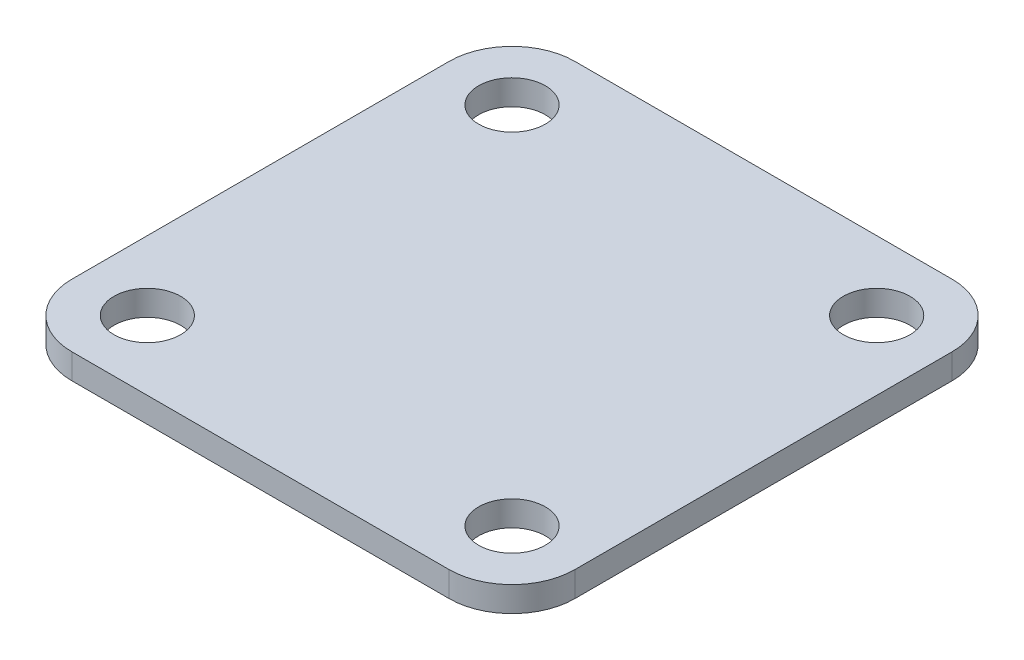
ISO-10303-21;
HEADER;
FILE_DESCRIPTION(('STEP AP214'),'2;1');
FILE_NAME('part.step','',(''),(''),'','','');
FILE_SCHEMA(('AUTOMOTIVE_DESIGN { 1 0 10303 214 1 1 1 1 }'));
ENDSEC;
DATA;
#1=APPLICATION_CONTEXT('core data for automotive mechanical design processes');
#2=APPLICATION_PROTOCOL_DEFINITION('international standard','automotive_design',2000,#1);
#3=PRODUCT_CONTEXT('',#1,'mechanical');
#4=PRODUCT('Part','Part','',(#3));
#5=PRODUCT_RELATED_PRODUCT_CATEGORY('part','',(#4));
#6=PRODUCT_DEFINITION_FORMATION('','',#4);
#7=PRODUCT_DEFINITION_CONTEXT('part definition',#1,'design');
#8=PRODUCT_DEFINITION('design','',#6,#7);
#9=PRODUCT_DEFINITION_SHAPE('','',#8);
#10=(LENGTH_UNIT() NAMED_UNIT(*) SI_UNIT(.MILLI.,.METRE.));
#11=(NAMED_UNIT(*) PLANE_ANGLE_UNIT() SI_UNIT($,.RADIAN.));
#12=(NAMED_UNIT(*) SI_UNIT($,.STERADIAN.) SOLID_ANGLE_UNIT());
#13=UNCERTAINTY_MEASURE_WITH_UNIT(LENGTH_MEASURE(1.E-05),#10,'distance_accuracy_value','');
#14=(GEOMETRIC_REPRESENTATION_CONTEXT(3) GLOBAL_UNCERTAINTY_ASSIGNED_CONTEXT((#13)) GLOBAL_UNIT_ASSIGNED_CONTEXT((#10,
#11,#12)) REPRESENTATION_CONTEXT('',''));
#15=CARTESIAN_POINT('',(0.,0.,0.));
#16=DIRECTION('',(0.,0.,1.));
#17=DIRECTION('',(1.,0.,0.));
#18=AXIS2_PLACEMENT_3D('',#15,#16,#17);
#19=CARTESIAN_POINT('',(5.,2.,-5.));
#20=DIRECTION('',(0.,-1.,0.));
#21=DIRECTION('',(0.,0.,-1.));
#22=AXIS2_PLACEMENT_3D('',#19,#20,#21);
#23=PLANE('',#22);
#24=CARTESIAN_POINT('',(5.,2.,-5.));
#25=DIRECTION('',(0.,1.,0.));
#26=DIRECTION('',(0.,0.,-1.));
#27=AXIS2_PLACEMENT_3D('',#24,#25,#26);
#28=CIRCLE('',#27,5.);
#29=CARTESIAN_POINT('',(0.,2.,-5.));
#30=VERTEX_POINT('',#29);
#31=CARTESIAN_POINT('',(5.,2.,0.));
#32=VERTEX_POINT('',#31);
#33=EDGE_CURVE('E147',#30,#32,#28,.T.);
#34=ORIENTED_EDGE('',*,*,#33,.T.);
#35=DIRECTION('',(1.,0.,0.));
#36=VECTOR('',#35,1.);
#37=CARTESIAN_POINT('',(5.,2.,0.));
#38=LINE('',#37,#36);
#39=CARTESIAN_POINT('',(35.,2.,0.));
#40=VERTEX_POINT('',#39);
#41=EDGE_CURVE('E95',#32,#40,#38,.T.);
#42=ORIENTED_EDGE('',*,*,#41,.T.);
#43=CARTESIAN_POINT('',(35.,2.,-5.));
#44=DIRECTION('',(0.,1.,0.));
#45=DIRECTION('',(0.,0.,1.));
#46=AXIS2_PLACEMENT_3D('',#43,#44,#45);
#47=CIRCLE('',#46,5.);
#48=CARTESIAN_POINT('',(40.,2.,-5.));
#49=VERTEX_POINT('',#48);
#50=EDGE_CURVE('E234',#40,#49,#47,.T.);
#51=ORIENTED_EDGE('',*,*,#50,.T.);
#52=DIRECTION('',(0.,0.,-1.));
#53=VECTOR('',#52,1.);
#54=CARTESIAN_POINT('',(40.,2.,-5.));
#55=LINE('',#54,#53);
#56=CARTESIAN_POINT('',(40.,2.,-35.));
#57=VERTEX_POINT('',#56);
#58=EDGE_CURVE('E236',#49,#57,#55,.T.);
#59=ORIENTED_EDGE('',*,*,#58,.T.);
#60=CARTESIAN_POINT('',(35.,2.,-35.));
#61=DIRECTION('',(0.,1.,0.));
#62=DIRECTION('',(0.,0.,-1.));
#63=AXIS2_PLACEMENT_3D('',#60,#61,#62);
#64=CIRCLE('',#63,5.);
#65=CARTESIAN_POINT('',(35.,2.,-40.));
#66=VERTEX_POINT('',#65);
#67=EDGE_CURVE('E114',#57,#66,#64,.T.);
#68=ORIENTED_EDGE('',*,*,#67,.T.);
#69=DIRECTION('',(-1.,0.,0.));
#70=VECTOR('',#69,1.);
#71=CARTESIAN_POINT('',(5.,2.,-40.));
#72=LINE('',#71,#70);
#73=CARTESIAN_POINT('',(5.,2.,-40.));
#74=VERTEX_POINT('',#73);
#75=EDGE_CURVE('E108',#66,#74,#72,.T.);
#76=ORIENTED_EDGE('',*,*,#75,.T.);
#77=CARTESIAN_POINT('',(5.,2.,-35.));
#78=DIRECTION('',(0.,1.,0.));
#79=DIRECTION('',(0.,0.,-1.));
#80=AXIS2_PLACEMENT_3D('',#77,#78,#79);
#81=CIRCLE('',#80,5.);
#82=CARTESIAN_POINT('',(0.,2.,-35.));
#83=VERTEX_POINT('',#82);
#84=EDGE_CURVE('E112',#74,#83,#81,.T.);
#85=ORIENTED_EDGE('',*,*,#84,.T.);
#86=DIRECTION('',(0.,0.,1.));
#87=VECTOR('',#86,1.);
#88=CARTESIAN_POINT('',(0.,2.,-5.));
#89=LINE('',#88,#87);
#90=EDGE_CURVE('E51',#83,#30,#89,.T.);
#91=ORIENTED_EDGE('',*,*,#90,.T.);
#92=EDGE_LOOP('',(#34,#42,#51,#59,#68,#76,#85,#91));
#93=FACE_BOUND('',#92,.T.);
#94=CARTESIAN_POINT('',(5.50000000000001,2.,-34.5));
#95=DIRECTION('',(0.,1.,0.));
#96=DIRECTION('',(0.,0.,1.));
#97=AXIS2_PLACEMENT_3D('',#94,#95,#96);
#98=CIRCLE('',#97,2.65);
#99=CARTESIAN_POINT('',(5.50000000000001,2.,-31.85));
#100=VERTEX_POINT('',#99);
#101=EDGE_CURVE('E136',#100,#100,#98,.T.);
#102=ORIENTED_EDGE('',*,*,#101,.F.);
#103=EDGE_LOOP('',(#102));
#104=FACE_BOUND('',#103,.T.);
#105=CARTESIAN_POINT('',(34.5,2.,-34.5));
#106=DIRECTION('',(0.,1.,0.));
#107=DIRECTION('',(0.,0.,1.));
#108=AXIS2_PLACEMENT_3D('',#105,#106,#107);
#109=CIRCLE('',#108,2.65);
#110=CARTESIAN_POINT('',(34.5,2.,-31.85));
#111=VERTEX_POINT('',#110);
#112=EDGE_CURVE('E245',#111,#111,#109,.T.);
#113=ORIENTED_EDGE('',*,*,#112,.F.);
#114=EDGE_LOOP('',(#113));
#115=FACE_BOUND('',#114,.T.);
#116=CARTESIAN_POINT('',(34.5,2.,-5.5));
#117=DIRECTION('',(0.,1.,0.));
#118=DIRECTION('',(0.,0.,1.));
#119=AXIS2_PLACEMENT_3D('',#116,#117,#118);
#120=CIRCLE('',#119,2.65);
#121=CARTESIAN_POINT('',(34.5,2.,-2.85));
#122=VERTEX_POINT('',#121);
#123=EDGE_CURVE('E251',#122,#122,#120,.T.);
#124=ORIENTED_EDGE('',*,*,#123,.F.);
#125=EDGE_LOOP('',(#124));
#126=FACE_BOUND('',#125,.T.);
#127=CARTESIAN_POINT('',(5.5,2.,-5.5));
#128=DIRECTION('',(0.,1.,0.));
#129=DIRECTION('',(0.,0.,1.));
#130=AXIS2_PLACEMENT_3D('',#127,#128,#129);
#131=CIRCLE('',#130,2.65);
#132=CARTESIAN_POINT('',(5.5,2.,-2.85));
#133=VERTEX_POINT('',#132);
#134=EDGE_CURVE('E257',#133,#133,#131,.T.);
#135=ORIENTED_EDGE('',*,*,#134,.F.);
#136=EDGE_LOOP('',(#135));
#137=FACE_BOUND('',#136,.T.);
#138=ADVANCED_FACE('F34',(#93,#104,#115,#126,#137),#23,.F.);
#139=CARTESIAN_POINT('',(5.,0.,-5.));
#140=DIRECTION('',(0.,-1.,0.));
#141=DIRECTION('',(0.,0.,-1.));
#142=AXIS2_PLACEMENT_3D('',#139,#140,#141);
#143=PLANE('',#142);
#144=CARTESIAN_POINT('',(20.,0.,-20.));
#145=DIRECTION('',(0.,-1.,0.));
#146=DIRECTION('',(0.,0.,-1.));
#147=AXIS2_PLACEMENT_3D('',#144,#145,#146);
#148=CIRCLE('',#147,16.);
#149=CARTESIAN_POINT('',(20.,0.,-36.));
#150=VERTEX_POINT('',#149);
#151=EDGE_CURVE('E11',#150,#150,#148,.F.);
#152=ORIENTED_EDGE('',*,*,#151,.T.);
#153=EDGE_LOOP('',(#152));
#154=FACE_BOUND('',#153,.T.);
#155=CARTESIAN_POINT('',(34.5,0.,-5.5));
#156=DIRECTION('',(0.,1.,0.));
#157=DIRECTION('',(0.,0.,1.));
#158=AXIS2_PLACEMENT_3D('',#155,#156,#157);
#159=CIRCLE('',#158,2.65);
#160=CARTESIAN_POINT('',(34.5,0.,-2.85));
#161=VERTEX_POINT('',#160);
#162=EDGE_CURVE('E254',#161,#161,#159,.T.);
#163=ORIENTED_EDGE('',*,*,#162,.T.);
#164=EDGE_LOOP('',(#163));
#165=FACE_BOUND('',#164,.T.);
#166=CARTESIAN_POINT('',(5.50000000000001,0.,-34.5));
#167=DIRECTION('',(0.,1.,0.));
#168=DIRECTION('',(0.,0.,1.));
#169=AXIS2_PLACEMENT_3D('',#166,#167,#168);
#170=CIRCLE('',#169,2.65);
#171=CARTESIAN_POINT('',(5.50000000000001,0.,-31.85));
#172=VERTEX_POINT('',#171);
#173=EDGE_CURVE('E242',#172,#172,#170,.T.);
#174=ORIENTED_EDGE('',*,*,#173,.T.);
#175=EDGE_LOOP('',(#174));
#176=FACE_BOUND('',#175,.T.);
#177=CARTESIAN_POINT('',(5.,0.,-5.));
#178=DIRECTION('',(0.,1.,0.));
#179=DIRECTION('',(0.,0.,-1.));
#180=AXIS2_PLACEMENT_3D('',#177,#178,#179);
#181=CIRCLE('',#180,5.);
#182=CARTESIAN_POINT('',(0.,0.,-5.));
#183=VERTEX_POINT('',#182);
#184=CARTESIAN_POINT('',(5.,0.,0.));
#185=VERTEX_POINT('',#184);
#186=EDGE_CURVE('E132',#183,#185,#181,.T.);
#187=ORIENTED_EDGE('',*,*,#186,.F.);
#188=DIRECTION('',(0.,0.,1.));
#189=VECTOR('',#188,1.);
#190=CARTESIAN_POINT('',(0.,0.,-5.));
#191=LINE('',#190,#189);
#192=CARTESIAN_POINT('',(0.,0.,-35.));
#193=VERTEX_POINT('',#192);
#194=EDGE_CURVE('E86',#193,#183,#191,.T.);
#195=ORIENTED_EDGE('',*,*,#194,.F.);
#196=CARTESIAN_POINT('',(5.,0.,-35.));
#197=DIRECTION('',(0.,1.,0.));
#198=DIRECTION('',(0.,0.,-1.));
#199=AXIS2_PLACEMENT_3D('',#196,#197,#198);
#200=CIRCLE('',#199,5.);
#201=CARTESIAN_POINT('',(5.,0.,-40.));
#202=VERTEX_POINT('',#201);
#203=EDGE_CURVE('E80',#202,#193,#200,.T.);
#204=ORIENTED_EDGE('',*,*,#203,.F.);
#205=DIRECTION('',(-1.,0.,0.));
#206=VECTOR('',#205,1.);
#207=CARTESIAN_POINT('',(5.,0.,-40.));
#208=LINE('',#207,#206);
#209=CARTESIAN_POINT('',(35.,0.,-40.));
#210=VERTEX_POINT('',#209);
#211=EDGE_CURVE('E122',#210,#202,#208,.T.);
#212=ORIENTED_EDGE('',*,*,#211,.F.);
#213=CARTESIAN_POINT('',(35.,0.,-35.));
#214=DIRECTION('',(0.,1.,0.));
#215=DIRECTION('',(0.,0.,-1.));
#216=AXIS2_PLACEMENT_3D('',#213,#214,#215);
#217=CIRCLE('',#216,5.);
#218=CARTESIAN_POINT('',(40.,0.,-35.));
#219=VERTEX_POINT('',#218);
#220=EDGE_CURVE('E142',#219,#210,#217,.T.);
#221=ORIENTED_EDGE('',*,*,#220,.F.);
#222=DIRECTION('',(0.,0.,-1.));
#223=VECTOR('',#222,1.);
#224=CARTESIAN_POINT('',(40.,0.,-5.));
#225=LINE('',#224,#223);
#226=CARTESIAN_POINT('',(40.,0.,-5.));
#227=VERTEX_POINT('',#226);
#228=EDGE_CURVE('E140',#227,#219,#225,.T.);
#229=ORIENTED_EDGE('',*,*,#228,.F.);
#230=CARTESIAN_POINT('',(35.,0.,-5.));
#231=DIRECTION('',(0.,1.,0.));
#232=DIRECTION('',(0.,0.,1.));
#233=AXIS2_PLACEMENT_3D('',#230,#231,#232);
#234=CIRCLE('',#233,5.);
#235=CARTESIAN_POINT('',(35.,0.,0.));
#236=VERTEX_POINT('',#235);
#237=EDGE_CURVE('E138',#236,#227,#234,.T.);
#238=ORIENTED_EDGE('',*,*,#237,.F.);
#239=DIRECTION('',(1.,0.,0.));
#240=VECTOR('',#239,1.);
#241=CARTESIAN_POINT('',(5.,0.,0.));
#242=LINE('',#241,#240);
#243=EDGE_CURVE('E135',#185,#236,#242,.T.);
#244=ORIENTED_EDGE('',*,*,#243,.F.);
#245=EDGE_LOOP('',(#187,#195,#204,#212,#221,#229,#238,#244));
#246=FACE_BOUND('',#245,.T.);
#247=CARTESIAN_POINT('',(34.5,0.,-34.5));
#248=DIRECTION('',(0.,1.,0.));
#249=DIRECTION('',(0.,0.,1.));
#250=AXIS2_PLACEMENT_3D('',#247,#248,#249);
#251=CIRCLE('',#250,2.65);
#252=CARTESIAN_POINT('',(34.5,0.,-31.85));
#253=VERTEX_POINT('',#252);
#254=EDGE_CURVE('E248',#253,#253,#251,.T.);
#255=ORIENTED_EDGE('',*,*,#254,.T.);
#256=EDGE_LOOP('',(#255));
#257=FACE_BOUND('',#256,.T.);
#258=CARTESIAN_POINT('',(5.5,0.,-5.5));
#259=DIRECTION('',(0.,1.,0.));
#260=DIRECTION('',(0.,0.,1.));
#261=AXIS2_PLACEMENT_3D('',#258,#259,#260);
#262=CIRCLE('',#261,2.65);
#263=CARTESIAN_POINT('',(5.5,0.,-2.85));
#264=VERTEX_POINT('',#263);
#265=EDGE_CURVE('E260',#264,#264,#262,.T.);
#266=ORIENTED_EDGE('',*,*,#265,.T.);
#267=EDGE_LOOP('',(#266));
#268=FACE_BOUND('',#267,.T.);
#269=ADVANCED_FACE('F187',(#154,#165,#176,#246,#257,#268),#143,.T.);
#270=CARTESIAN_POINT('',(5.,2.,-5.));
#271=DIRECTION('',(0.,-1.,0.));
#272=DIRECTION('',(0.,0.,-1.));
#273=AXIS2_PLACEMENT_3D('',#270,#271,#272);
#274=CYLINDRICAL_SURFACE('',#273,5.);
#275=ORIENTED_EDGE('',*,*,#186,.T.);
#276=DIRECTION('',(0.,-1.,0.));
#277=VECTOR('',#276,1.);
#278=CARTESIAN_POINT('',(5.,2.,0.));
#279=LINE('',#278,#277);
#280=EDGE_CURVE('E160',#32,#185,#279,.T.);
#281=ORIENTED_EDGE('',*,*,#280,.F.);
#282=ORIENTED_EDGE('',*,*,#33,.F.);
#283=DIRECTION('',(0.,-1.,0.));
#284=VECTOR('',#283,1.);
#285=CARTESIAN_POINT('',(0.,2.,-5.));
#286=LINE('',#285,#284);
#287=EDGE_CURVE('E128',#30,#183,#286,.T.);
#288=ORIENTED_EDGE('',*,*,#287,.T.);
#289=EDGE_LOOP('',(#275,#281,#282,#288));
#290=FACE_BOUND('',#289,.T.);
#291=ADVANCED_FACE('F192',(#290),#274,.T.);
#292=CARTESIAN_POINT('',(5.,2.,0.));
#293=DIRECTION('',(0.,0.,-1.));
#294=DIRECTION('',(-1.,0.,0.));
#295=AXIS2_PLACEMENT_3D('',#292,#293,#294);
#296=PLANE('',#295);
#297=ORIENTED_EDGE('',*,*,#243,.T.);
#298=DIRECTION('',(0.,-1.,0.));
#299=VECTOR('',#298,1.);
#300=CARTESIAN_POINT('',(35.,2.,0.));
#301=LINE('',#300,#299);
#302=EDGE_CURVE('E157',#40,#236,#301,.T.);
#303=ORIENTED_EDGE('',*,*,#302,.F.);
#304=ORIENTED_EDGE('',*,*,#41,.F.);
#305=ORIENTED_EDGE('',*,*,#280,.T.);
#306=EDGE_LOOP('',(#297,#303,#304,#305));
#307=FACE_BOUND('',#306,.T.);
#308=ADVANCED_FACE('F217',(#307),#296,.F.);
#309=CARTESIAN_POINT('',(35.,2.,-5.));
#310=DIRECTION('',(0.,-1.,0.));
#311=DIRECTION('',(0.,0.,-1.));
#312=AXIS2_PLACEMENT_3D('',#309,#310,#311);
#313=CYLINDRICAL_SURFACE('',#312,5.);
#314=ORIENTED_EDGE('',*,*,#237,.T.);
#315=DIRECTION('',(0.,-1.,0.));
#316=VECTOR('',#315,1.);
#317=CARTESIAN_POINT('',(40.,2.,-5.));
#318=LINE('',#317,#316);
#319=EDGE_CURVE('E154',#49,#227,#318,.T.);
#320=ORIENTED_EDGE('',*,*,#319,.F.);
#321=ORIENTED_EDGE('',*,*,#50,.F.);
#322=ORIENTED_EDGE('',*,*,#302,.T.);
#323=EDGE_LOOP('',(#314,#320,#321,#322));
#324=FACE_BOUND('',#323,.T.);
#325=ADVANCED_FACE('F213',(#324),#313,.T.);
#326=CARTESIAN_POINT('',(40.,2.,-5.));
#327=DIRECTION('',(-1.,0.,0.));
#328=DIRECTION('',(0.,0.,1.));
#329=AXIS2_PLACEMENT_3D('',#326,#327,#328);
#330=PLANE('',#329);
#331=ORIENTED_EDGE('',*,*,#228,.T.);
#332=DIRECTION('',(0.,-1.,0.));
#333=VECTOR('',#332,1.);
#334=CARTESIAN_POINT('',(40.,2.,-35.));
#335=LINE('',#334,#333);
#336=EDGE_CURVE('E151',#57,#219,#335,.T.);
#337=ORIENTED_EDGE('',*,*,#336,.F.);
#338=ORIENTED_EDGE('',*,*,#58,.F.);
#339=ORIENTED_EDGE('',*,*,#319,.T.);
#340=EDGE_LOOP('',(#331,#337,#338,#339));
#341=FACE_BOUND('',#340,.T.);
#342=ADVANCED_FACE('F209',(#341),#330,.F.);
#343=CARTESIAN_POINT('',(35.,2.,-35.));
#344=DIRECTION('',(0.,-1.,0.));
#345=DIRECTION('',(0.,0.,-1.));
#346=AXIS2_PLACEMENT_3D('',#343,#344,#345);
#347=CYLINDRICAL_SURFACE('',#346,5.);
#348=ORIENTED_EDGE('',*,*,#220,.T.);
#349=DIRECTION('',(0.,-1.,0.));
#350=VECTOR('',#349,1.);
#351=CARTESIAN_POINT('',(35.,2.,-40.));
#352=LINE('',#351,#350);
#353=EDGE_CURVE('E123',#66,#210,#352,.T.);
#354=ORIENTED_EDGE('',*,*,#353,.F.);
#355=ORIENTED_EDGE('',*,*,#67,.F.);
#356=ORIENTED_EDGE('',*,*,#336,.T.);
#357=EDGE_LOOP('',(#348,#354,#355,#356));
#358=FACE_BOUND('',#357,.T.);
#359=ADVANCED_FACE('F206',(#358),#347,.T.);
#360=CARTESIAN_POINT('',(5.,2.,-40.));
#361=DIRECTION('',(0.,0.,1.));
#362=DIRECTION('',(1.,0.,0.));
#363=AXIS2_PLACEMENT_3D('',#360,#361,#362);
#364=PLANE('',#363);
#365=ORIENTED_EDGE('',*,*,#211,.T.);
#366=DIRECTION('',(0.,-1.,0.));
#367=VECTOR('',#366,1.);
#368=CARTESIAN_POINT('',(5.,2.,-40.));
#369=LINE('',#368,#367);
#370=EDGE_CURVE('E119',#74,#202,#369,.T.);
#371=ORIENTED_EDGE('',*,*,#370,.F.);
#372=ORIENTED_EDGE('',*,*,#75,.F.);
#373=ORIENTED_EDGE('',*,*,#353,.T.);
#374=EDGE_LOOP('',(#365,#371,#372,#373));
#375=FACE_BOUND('',#374,.T.);
#376=ADVANCED_FACE('F120',(#375),#364,.F.);
#377=CARTESIAN_POINT('',(5.,2.,-35.));
#378=DIRECTION('',(0.,-1.,0.));
#379=DIRECTION('',(0.,0.,-1.));
#380=AXIS2_PLACEMENT_3D('',#377,#378,#379);
#381=CYLINDRICAL_SURFACE('',#380,5.);
#382=ORIENTED_EDGE('',*,*,#203,.T.);
#383=DIRECTION('',(0.,-1.,0.));
#384=VECTOR('',#383,1.);
#385=CARTESIAN_POINT('',(0.,2.,-35.));
#386=LINE('',#385,#384);
#387=EDGE_CURVE('E124',#83,#193,#386,.T.);
#388=ORIENTED_EDGE('',*,*,#387,.F.);
#389=ORIENTED_EDGE('',*,*,#84,.F.);
#390=ORIENTED_EDGE('',*,*,#370,.T.);
#391=EDGE_LOOP('',(#382,#388,#389,#390));
#392=FACE_BOUND('',#391,.T.);
#393=ADVANCED_FACE('F126',(#392),#381,.T.);
#394=CARTESIAN_POINT('',(0.,2.,-5.));
#395=DIRECTION('',(1.,0.,0.));
#396=DIRECTION('',(0.,0.,-1.));
#397=AXIS2_PLACEMENT_3D('',#394,#395,#396);
#398=PLANE('',#397);
#399=ORIENTED_EDGE('',*,*,#194,.T.);
#400=ORIENTED_EDGE('',*,*,#287,.F.);
#401=ORIENTED_EDGE('',*,*,#90,.F.);
#402=ORIENTED_EDGE('',*,*,#387,.T.);
#403=EDGE_LOOP('',(#399,#400,#401,#402));
#404=FACE_BOUND('',#403,.T.);
#405=ADVANCED_FACE('F199',(#404),#398,.F.);
#406=CARTESIAN_POINT('',(5.50000000000001,2.,-34.5));
#407=DIRECTION('',(0.,-1.,0.));
#408=DIRECTION('',(0.,0.,-1.));
#409=AXIS2_PLACEMENT_3D('',#406,#407,#408);
#410=CYLINDRICAL_SURFACE('',#409,2.65);
#411=ORIENTED_EDGE('',*,*,#101,.T.);
#412=EDGE_LOOP('',(#411));
#413=FACE_BOUND('',#412,.T.);
#414=ORIENTED_EDGE('',*,*,#173,.F.);
#415=EDGE_LOOP('',(#414));
#416=FACE_BOUND('',#415,.T.);
#417=ADVANCED_FACE('F196',(#413,#416),#410,.F.);
#418=CARTESIAN_POINT('',(34.5,2.,-34.5));
#419=DIRECTION('',(0.,-1.,0.));
#420=DIRECTION('',(0.,0.,-1.));
#421=AXIS2_PLACEMENT_3D('',#418,#419,#420);
#422=CYLINDRICAL_SURFACE('',#421,2.65);
#423=ORIENTED_EDGE('',*,*,#112,.T.);
#424=EDGE_LOOP('',(#423));
#425=FACE_BOUND('',#424,.T.);
#426=ORIENTED_EDGE('',*,*,#254,.F.);
#427=EDGE_LOOP('',(#426));
#428=FACE_BOUND('',#427,.T.);
#429=ADVANCED_FACE('F358',(#425,#428),#422,.F.);
#430=CARTESIAN_POINT('',(34.5,2.,-5.5));
#431=DIRECTION('',(0.,-1.,0.));
#432=DIRECTION('',(0.,0.,-1.));
#433=AXIS2_PLACEMENT_3D('',#430,#431,#432);
#434=CYLINDRICAL_SURFACE('',#433,2.65);
#435=ORIENTED_EDGE('',*,*,#123,.T.);
#436=EDGE_LOOP('',(#435));
#437=FACE_BOUND('',#436,.T.);
#438=ORIENTED_EDGE('',*,*,#162,.F.);
#439=EDGE_LOOP('',(#438));
#440=FACE_BOUND('',#439,.T.);
#441=ADVANCED_FACE('F181',(#437,#440),#434,.F.);
#442=CARTESIAN_POINT('',(5.5,2.,-5.5));
#443=DIRECTION('',(0.,-1.,0.));
#444=DIRECTION('',(0.,0.,-1.));
#445=AXIS2_PLACEMENT_3D('',#442,#443,#444);
#446=CYLINDRICAL_SURFACE('',#445,2.65);
#447=ORIENTED_EDGE('',*,*,#134,.T.);
#448=EDGE_LOOP('',(#447));
#449=FACE_BOUND('',#448,.T.);
#450=ORIENTED_EDGE('',*,*,#265,.F.);
#451=EDGE_LOOP('',(#450));
#452=FACE_BOUND('',#451,.T.);
#453=ADVANCED_FACE('F175',(#449,#452),#446,.F.);
#454=CARTESIAN_POINT('',(20.,-3.,-20.));
#455=DIRECTION('',(0.,-1.,0.));
#456=DIRECTION('',(0.,0.,-1.));
#457=AXIS2_PLACEMENT_3D('',#454,#455,#456);
#458=PLANE('',#457);
#459=CARTESIAN_POINT('',(20.,-3.,-20.));
#460=DIRECTION('',(0.,1.,0.));
#461=DIRECTION('',(0.,0.,1.));
#462=AXIS2_PLACEMENT_3D('',#459,#460,#461);
#463=CIRCLE('',#462,11.9688711258507);
#464=CARTESIAN_POINT('',(20.,-3.,-8.03112887414927));
#465=VERTEX_POINT('',#464);
#466=EDGE_CURVE('E268',#465,#465,#463,.F.);
#467=ORIENTED_EDGE('',*,*,#466,.F.);
#468=EDGE_LOOP('',(#467));
#469=FACE_BOUND('',#468,.T.);
#470=CARTESIAN_POINT('',(20.,-3.,-20.));
#471=DIRECTION('',(0.,-1.,0.));
#472=DIRECTION('',(0.,0.,-1.));
#473=AXIS2_PLACEMENT_3D('',#470,#471,#472);
#474=CIRCLE('',#473,13.);
#475=CARTESIAN_POINT('',(20.,-3.,-33.));
#476=VERTEX_POINT('',#475);
#477=EDGE_CURVE('E162',#476,#476,#474,.T.);
#478=ORIENTED_EDGE('',*,*,#477,.T.);
#479=EDGE_LOOP('',(#478));
#480=FACE_BOUND('',#479,.T.);
#481=ADVANCED_FACE('F171',(#469,#480),#458,.T.);
#482=CARTESIAN_POINT('',(20.,-1.,-20.));
#483=DIRECTION('',(0.,-1.,0.));
#484=DIRECTION('',(0.,0.,-1.));
#485=AXIS2_PLACEMENT_3D('',#482,#483,#484);
#486=TOROIDAL_SURFACE('',#485,13.,2.);
#487=CARTESIAN_POINT('',(20.,-1.,-20.));
#488=DIRECTION('',(0.,-1.,0.));
#489=DIRECTION('',(0.,0.,-1.));
#490=AXIS2_PLACEMENT_3D('',#487,#488,#489);
#491=CIRCLE('',#490,15.);
#492=CARTESIAN_POINT('',(20.,-1.,-35.));
#493=VERTEX_POINT('',#492);
#494=EDGE_CURVE('E43',#493,#493,#491,.F.);
#495=ORIENTED_EDGE('',*,*,#494,.F.);
#496=EDGE_LOOP('',(#495));
#497=FACE_BOUND('',#496,.T.);
#498=ORIENTED_EDGE('',*,*,#477,.F.);
#499=EDGE_LOOP('',(#498));
#500=FACE_BOUND('',#499,.T.);
#501=ADVANCED_FACE('F168',(#497,#500),#486,.T.);
#502=CARTESIAN_POINT('',(20.,-1.,-20.));
#503=DIRECTION('',(0.,-1.,0.));
#504=DIRECTION('',(0.,0.,-1.));
#505=AXIS2_PLACEMENT_3D('',#502,#503,#504);
#506=TOROIDAL_SURFACE('',#505,16.,1.);
#507=ORIENTED_EDGE('',*,*,#151,.F.);
#508=EDGE_LOOP('',(#507));
#509=FACE_BOUND('',#508,.T.);
#510=ORIENTED_EDGE('',*,*,#494,.T.);
#511=EDGE_LOOP('',(#510));
#512=FACE_BOUND('',#511,.T.);
#513=ADVANCED_FACE('F36',(#509,#512),#506,.F.);
#514=CARTESIAN_POINT('',(20.,-1.,-20.));
#515=DIRECTION('',(0.,-1.,0.));
#516=DIRECTION('',(0.,0.,-1.));
#517=AXIS2_PLACEMENT_3D('',#514,#515,#516);
#518=TOROIDAL_SURFACE('',#517,16.,4.5);
#519=ORIENTED_EDGE('',*,*,#466,.T.);
#520=EDGE_LOOP('',(#519));
#521=FACE_BOUND('',#520,.T.);
#522=CARTESIAN_POINT('',(20.,-1.5,-20.));
#523=DIRECTION('',(0.,1.,0.));
#524=DIRECTION('',(0.,0.,1.));
#525=AXIS2_PLACEMENT_3D('',#522,#523,#524);
#526=CIRCLE('',#525,11.5278640450004);
#527=CARTESIAN_POINT('',(20.,-1.5,-8.47213595499958));
#528=VERTEX_POINT('',#527);
#529=EDGE_CURVE('E263',#528,#528,#526,.T.);
#530=ORIENTED_EDGE('',*,*,#529,.T.);
#531=EDGE_LOOP('',(#530));
#532=FACE_BOUND('',#531,.T.);
#533=ADVANCED_FACE('F271',(#521,#532),#518,.T.);
#534=CARTESIAN_POINT('',(5.,-1.5,-5.));
#535=DIRECTION('',(0.,-1.,0.));
#536=DIRECTION('',(0.,0.,-1.));
#537=AXIS2_PLACEMENT_3D('',#534,#535,#536);
#538=PLANE('',#537);
#539=ORIENTED_EDGE('',*,*,#529,.F.);
#540=EDGE_LOOP('',(#539));
#541=FACE_BOUND('',#540,.T.);
#542=ADVANCED_FACE('F274',(#541),#538,.T.);
#543=CLOSED_SHELL('',(#138,#269,#291,#308,#325,#342,#359,#376,#393,#405,#417,#429,#441,#453,
#481,#501,#513,#533,#542));
#544=MANIFOLD_SOLID_BREP('B2',#543);
#545=ADVANCED_BREP_SHAPE_REPRESENTATION('',(#18,#544),#14);
#546=SHAPE_DEFINITION_REPRESENTATION(#9,#545);
ENDSEC;
END-ISO-10303-21;
